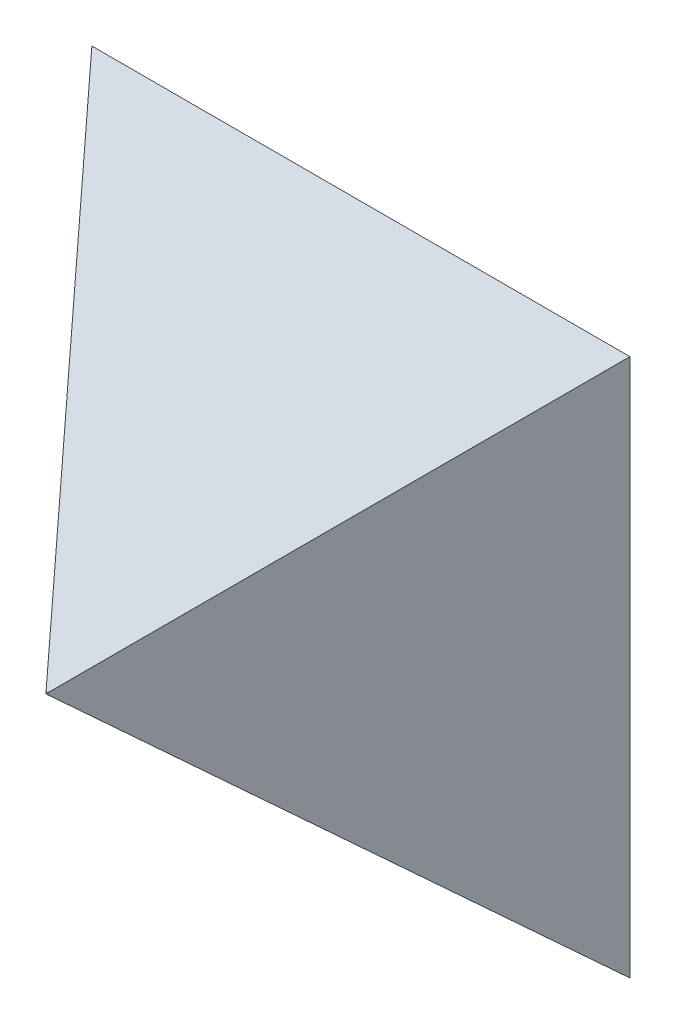
ISO-10303-21;
HEADER;
FILE_DESCRIPTION(('STEP AP214'),'2;1');
FILE_NAME('part.step','',(''),(''),'','','');
FILE_SCHEMA(('AUTOMOTIVE_DESIGN { 1 0 10303 214 1 1 1 1 }'));
ENDSEC;
DATA;
#1=APPLICATION_CONTEXT('core data for automotive mechanical design processes');
#2=APPLICATION_PROTOCOL_DEFINITION('international standard','automotive_design',2000,#1);
#3=PRODUCT_CONTEXT('',#1,'mechanical');
#4=PRODUCT('Part','Part','',(#3));
#5=PRODUCT_RELATED_PRODUCT_CATEGORY('part','',(#4));
#6=PRODUCT_DEFINITION_FORMATION('','',#4);
#7=PRODUCT_DEFINITION_CONTEXT('part definition',#1,'design');
#8=PRODUCT_DEFINITION('design','',#6,#7);
#9=PRODUCT_DEFINITION_SHAPE('','',#8);
#10=(LENGTH_UNIT() NAMED_UNIT(*) SI_UNIT(.MILLI.,.METRE.));
#11=(NAMED_UNIT(*) PLANE_ANGLE_UNIT() SI_UNIT($,.RADIAN.));
#12=(NAMED_UNIT(*) SI_UNIT($,.STERADIAN.) SOLID_ANGLE_UNIT());
#13=UNCERTAINTY_MEASURE_WITH_UNIT(LENGTH_MEASURE(1.E-05),#10,'distance_accuracy_value','');
#14=(GEOMETRIC_REPRESENTATION_CONTEXT(3) GLOBAL_UNCERTAINTY_ASSIGNED_CONTEXT((#13)) GLOBAL_UNIT_ASSIGNED_CONTEXT((#10,
#11,#12)) REPRESENTATION_CONTEXT('',''));
#15=CARTESIAN_POINT('',(0.,0.,0.));
#16=DIRECTION('',(0.,0.,1.));
#17=DIRECTION('',(1.,0.,0.));
#18=AXIS2_PLACEMENT_3D('',#15,#16,#17);
#19=CARTESIAN_POINT('',(-12.7,-12.7,0.));
#20=DIRECTION('',(0.,-0.76040596560003,0.649448048330185));
#21=DIRECTION('',(0.,-0.649448048330185,-0.76040596560003));
#22=AXIS2_PLACEMENT_3D('',#19,#20,#21);
#23=PLANE('',#22);
#24=DIRECTION('',(1.,0.,0.));
#25=VECTOR('',#24,1.);
#26=CARTESIAN_POINT('',(-12.7,-12.7,0.));
#27=LINE('',#26,#25);
#28=CARTESIAN_POINT('',(-12.7,-12.7,0.));
#29=VERTEX_POINT('',#28);
#30=CARTESIAN_POINT('',(12.7,-12.7,0.));
#31=VERTEX_POINT('',#30);
#32=EDGE_CURVE('E99',#29,#31,#27,.T.);
#33=ORIENTED_EDGE('',*,*,#32,.T.);
#34=DIRECTION('',(0.544662898606122,-0.544662898606122,-0.637718318510574));
#35=VECTOR('',#34,1.);
#36=CARTESIAN_POINT('',(12.7,-12.7,0.));
#37=LINE('',#36,#35);
#38=CARTESIAN_POINT('',(0.0460942986966247,-0.0460942986966265,14.81582));
#39=VERTEX_POINT('',#38);
#40=EDGE_CURVE('E92',#39,#31,#37,.T.);
#41=ORIENTED_EDGE('',*,*,#40,.F.);
#42=DIRECTION('',(-1.,0.,0.));
#43=VECTOR('',#42,1.);
#44=CARTESIAN_POINT('',(0.,-0.0460942986966266,14.81582));
#45=LINE('',#44,#43);
#46=CARTESIAN_POINT('',(-0.0460942986966213,-0.0460942986966265,14.81582));
#47=VERTEX_POINT('',#46);
#48=EDGE_CURVE('E50',#47,#39,#45,.F.);
#49=ORIENTED_EDGE('',*,*,#48,.F.);
#50=DIRECTION('',(-0.544662898606122,-0.544662898606122,-0.637718318510574));
#51=VECTOR('',#50,1.);
#52=CARTESIAN_POINT('',(-12.7,-12.7,0.));
#53=LINE('',#52,#51);
#54=EDGE_CURVE('E103',#47,#29,#53,.T.);
#55=ORIENTED_EDGE('',*,*,#54,.T.);
#56=EDGE_LOOP('',(#33,#41,#49,#55));
#57=FACE_BOUND('',#56,.T.);
#58=CARTESIAN_POINT('',(0.,-6.37304714934832,7.40791));
#59=DIRECTION('',(0.,-0.76040596560003,0.649448048330185));
#60=DIRECTION('',(0.,-0.649448048330185,-0.76040596560003));
#61=AXIS2_PLACEMENT_3D('',#58,#59,#60);
#62=ELLIPSE('',#61,2.19208564294295,1.666875);
#63=CARTESIAN_POINT('',(0.,-7.79669289193024,5.741035));
#64=VERTEX_POINT('',#63);
#65=EDGE_CURVE('E37',#64,#64,#62,.T.);
#66=ORIENTED_EDGE('',*,*,#65,.F.);
#67=EDGE_LOOP('',(#66));
#68=FACE_BOUND('',#67,.T.);
#69=ADVANCED_FACE('F33',(#57,#68),#23,.T.);
#70=CARTESIAN_POINT('',(12.7,-12.7,0.));
#71=DIRECTION('',(0.76040596560003,0.,0.649448048330185));
#72=DIRECTION('',(0.649448048330185,0.,-0.76040596560003));
#73=AXIS2_PLACEMENT_3D('',#70,#71,#72);
#74=PLANE('',#73);
#75=DIRECTION('',(0.,1.,0.));
#76=VECTOR('',#75,1.);
#77=CARTESIAN_POINT('',(12.7,-12.7,0.));
#78=LINE('',#77,#76);
#79=CARTESIAN_POINT('',(12.7,12.7,0.));
#80=VERTEX_POINT('',#79);
#81=EDGE_CURVE('E80',#31,#80,#78,.T.);
#82=ORIENTED_EDGE('',*,*,#81,.T.);
#83=DIRECTION('',(0.544662898606122,0.544662898606122,-0.637718318510574));
#84=VECTOR('',#83,1.);
#85=CARTESIAN_POINT('',(5.16489510280222,5.16489510280222,8.82247429949646));
#86=LINE('',#85,#84);
#87=CARTESIAN_POINT('',(0.0460942986966247,0.0460942986966195,14.81582));
#88=VERTEX_POINT('',#87);
#89=EDGE_CURVE('E11',#88,#80,#86,.T.);
#90=ORIENTED_EDGE('',*,*,#89,.F.);
#91=DIRECTION('',(0.,-1.,0.));
#92=VECTOR('',#91,1.);
#93=CARTESIAN_POINT('',(0.0460942986966243,0.,14.81582));
#94=LINE('',#93,#92);
#95=EDGE_CURVE('E100',#39,#88,#94,.F.);
#96=ORIENTED_EDGE('',*,*,#95,.F.);
#97=ORIENTED_EDGE('',*,*,#40,.T.);
#98=EDGE_LOOP('',(#82,#90,#96,#97));
#99=FACE_BOUND('',#98,.T.);
#100=ADVANCED_FACE('F91',(#99),#74,.T.);
#101=CARTESIAN_POINT('',(-12.7,12.7,0.));
#102=DIRECTION('',(0.,0.76040596560003,0.649448048330185));
#103=DIRECTION('',(0.,-0.649448048330185,0.76040596560003));
#104=AXIS2_PLACEMENT_3D('',#101,#102,#103);
#105=PLANE('',#104);
#106=DIRECTION('',(-1.,0.,0.));
#107=VECTOR('',#106,1.);
#108=CARTESIAN_POINT('',(-12.7,12.7,0.));
#109=LINE('',#108,#107);
#110=CARTESIAN_POINT('',(-12.7,12.7,0.));
#111=VERTEX_POINT('',#110);
#112=EDGE_CURVE('E76',#80,#111,#109,.T.);
#113=ORIENTED_EDGE('',*,*,#112,.T.);
#114=DIRECTION('',(-0.544662898606122,0.544662898606122,-0.637718318510574));
#115=VECTOR('',#114,1.);
#116=CARTESIAN_POINT('',(-5.16489510280222,5.16489510280222,8.82247429949646));
#117=LINE('',#116,#115);
#118=CARTESIAN_POINT('',(-0.0460942986966213,0.0460942986966195,14.81582));
#119=VERTEX_POINT('',#118);
#120=EDGE_CURVE('E42',#119,#111,#117,.T.);
#121=ORIENTED_EDGE('',*,*,#120,.F.);
#122=DIRECTION('',(1.,0.,0.));
#123=VECTOR('',#122,1.);
#124=CARTESIAN_POINT('',(0.,0.0460942986966197,14.81582));
#125=LINE('',#124,#123);
#126=EDGE_CURVE('E87',#88,#119,#125,.F.);
#127=ORIENTED_EDGE('',*,*,#126,.F.);
#128=ORIENTED_EDGE('',*,*,#89,.T.);
#129=EDGE_LOOP('',(#113,#121,#127,#128));
#130=FACE_BOUND('',#129,.T.);
#131=ADVANCED_FACE('F35',(#130),#105,.T.);
#132=CARTESIAN_POINT('',(-12.7,-12.7,0.));
#133=DIRECTION('',(-0.76040596560003,0.,0.649448048330185));
#134=DIRECTION('',(0.649448048330185,0.,0.76040596560003));
#135=AXIS2_PLACEMENT_3D('',#132,#133,#134);
#136=PLANE('',#135);
#137=DIRECTION('',(0.,-1.,0.));
#138=VECTOR('',#137,1.);
#139=CARTESIAN_POINT('',(-12.7,-12.7,0.));
#140=LINE('',#139,#138);
#141=EDGE_CURVE('E81',#111,#29,#140,.T.);
#142=ORIENTED_EDGE('',*,*,#141,.T.);
#143=ORIENTED_EDGE('',*,*,#54,.F.);
#144=DIRECTION('',(0.,1.,0.));
#145=VECTOR('',#144,1.);
#146=CARTESIAN_POINT('',(-0.046094298696622,0.,14.81582));
#147=LINE('',#146,#145);
#148=EDGE_CURVE('E55',#119,#47,#147,.F.);
#149=ORIENTED_EDGE('',*,*,#148,.F.);
#150=ORIENTED_EDGE('',*,*,#120,.T.);
#151=EDGE_LOOP('',(#142,#143,#149,#150));
#152=FACE_BOUND('',#151,.T.);
#153=ADVANCED_FACE('F111',(#152),#136,.T.);
#154=CARTESIAN_POINT('',(0.,0.,14.81582));
#155=DIRECTION('',(0.,0.,-1.));
#156=DIRECTION('',(-1.,0.,0.));
#157=AXIS2_PLACEMENT_3D('',#154,#155,#156);
#158=PLANE('',#157);
#159=ORIENTED_EDGE('',*,*,#95,.T.);
#160=ORIENTED_EDGE('',*,*,#126,.T.);
#161=ORIENTED_EDGE('',*,*,#148,.T.);
#162=ORIENTED_EDGE('',*,*,#48,.T.);
#163=EDGE_LOOP('',(#159,#160,#161,#162));
#164=FACE_BOUND('',#163,.T.);
#165=ADVANCED_FACE('F109',(#164),#158,.F.);
#166=CARTESIAN_POINT('',(0.,0.,0.));
#167=DIRECTION('',(0.,0.,-1.));
#168=DIRECTION('',(-1.,0.,0.));
#169=AXIS2_PLACEMENT_3D('',#166,#167,#168);
#170=PLANE('',#169);
#171=ORIENTED_EDGE('',*,*,#81,.F.);
#172=ORIENTED_EDGE('',*,*,#32,.F.);
#173=ORIENTED_EDGE('',*,*,#141,.F.);
#174=ORIENTED_EDGE('',*,*,#112,.F.);
#175=EDGE_LOOP('',(#171,#172,#173,#174));
#176=FACE_BOUND('',#175,.T.);
#177=ADVANCED_FACE('F77',(#176),#170,.T.);
#178=CARTESIAN_POINT('',(0.,0.,7.40791));
#179=DIRECTION('',(0.,-1.,0.));
#180=DIRECTION('',(0.,0.,-1.));
#181=AXIS2_PLACEMENT_3D('',#178,#179,#180);
#182=CYLINDRICAL_SURFACE('',#181,1.666875);
#183=CARTESIAN_POINT('',(0.,0.,7.40791));
#184=DIRECTION('',(0.,1.,0.));
#185=DIRECTION('',(0.,0.,1.));
#186=AXIS2_PLACEMENT_3D('',#183,#184,#185);
#187=CIRCLE('',#186,1.666875);
#188=CARTESIAN_POINT('',(0.,0.,9.074785));
#189=VERTEX_POINT('',#188);
#190=EDGE_CURVE('E95',#189,#189,#187,.T.);
#191=ORIENTED_EDGE('',*,*,#190,.T.);
#192=EDGE_LOOP('',(#191));
#193=FACE_BOUND('',#192,.T.);
#194=ORIENTED_EDGE('',*,*,#65,.T.);
#195=EDGE_LOOP('',(#194));
#196=FACE_BOUND('',#195,.T.);
#197=ADVANCED_FACE('F118',(#193,#196),#182,.F.);
#198=CARTESIAN_POINT('',(0.,0.,7.40791));
#199=DIRECTION('',(0.,1.,0.));
#200=DIRECTION('',(0.,0.,1.));
#201=AXIS2_PLACEMENT_3D('',#198,#199,#200);
#202=PLANE('',#201);
#203=ORIENTED_EDGE('',*,*,#190,.F.);
#204=EDGE_LOOP('',(#203));
#205=FACE_BOUND('',#204,.T.);
#206=ADVANCED_FACE('F120',(#205),#202,.F.);
#207=CLOSED_SHELL('',(#69,#100,#131,#153,#165,#177,#197,#206));
#208=MANIFOLD_SOLID_BREP('B2',#207);
#209=ADVANCED_BREP_SHAPE_REPRESENTATION('',(#18,#208),#14);
#210=SHAPE_DEFINITION_REPRESENTATION(#9,#209);
ENDSEC;
END-ISO-10303-21;
